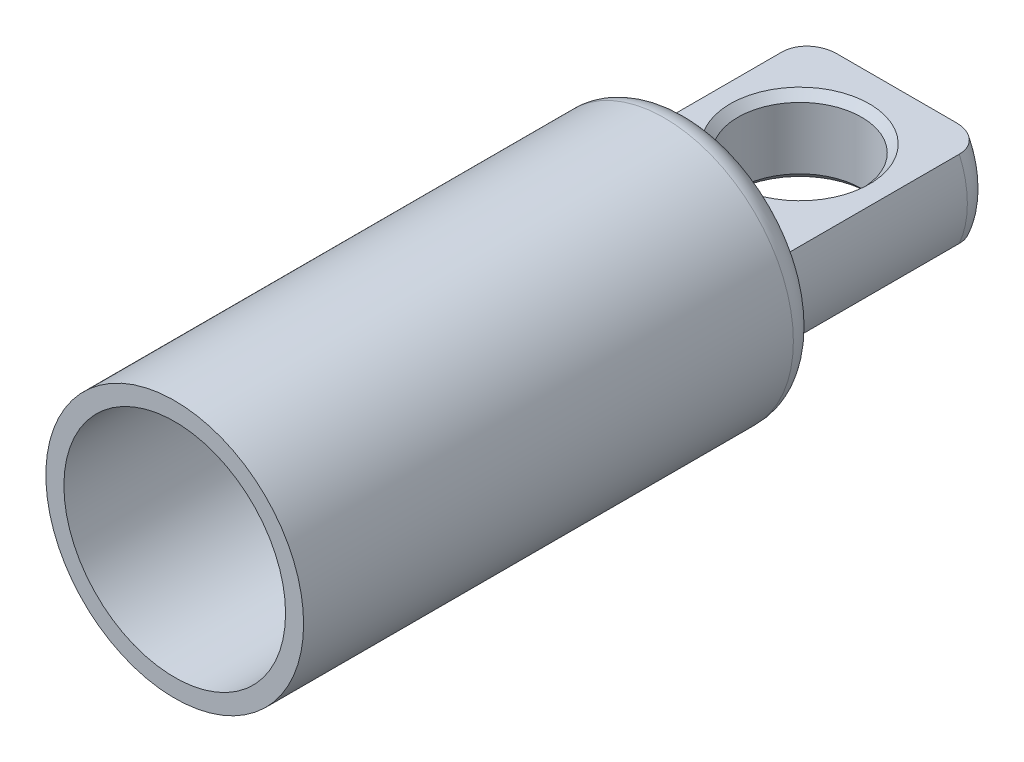
ISO-10303-21;
HEADER;
FILE_DESCRIPTION(('STEP AP214'),'2;1');
FILE_NAME('part.step','',(''),(''),'','','');
FILE_SCHEMA(('AUTOMOTIVE_DESIGN { 1 0 10303 214 1 1 1 1 }'));
ENDSEC;
DATA;
#1=APPLICATION_CONTEXT('core data for automotive mechanical design processes');
#2=APPLICATION_PROTOCOL_DEFINITION('international standard','automotive_design',2000,#1);
#3=PRODUCT_CONTEXT('',#1,'mechanical');
#4=PRODUCT('Part','Part','',(#3));
#5=PRODUCT_RELATED_PRODUCT_CATEGORY('part','',(#4));
#6=PRODUCT_DEFINITION_FORMATION('','',#4);
#7=PRODUCT_DEFINITION_CONTEXT('part definition',#1,'design');
#8=PRODUCT_DEFINITION('design','',#6,#7);
#9=PRODUCT_DEFINITION_SHAPE('','',#8);
#10=(LENGTH_UNIT() NAMED_UNIT(*) SI_UNIT(.MILLI.,.METRE.));
#11=(NAMED_UNIT(*) PLANE_ANGLE_UNIT() SI_UNIT($,.RADIAN.));
#12=(NAMED_UNIT(*) SI_UNIT($,.STERADIAN.) SOLID_ANGLE_UNIT());
#13=UNCERTAINTY_MEASURE_WITH_UNIT(LENGTH_MEASURE(1.E-05),#10,'distance_accuracy_value','');
#14=(GEOMETRIC_REPRESENTATION_CONTEXT(3) GLOBAL_UNCERTAINTY_ASSIGNED_CONTEXT((#13)) GLOBAL_UNIT_ASSIGNED_CONTEXT((#10,
#11,#12)) REPRESENTATION_CONTEXT('',''));
#15=CARTESIAN_POINT('',(0.,0.,0.));
#16=DIRECTION('',(0.,0.,1.));
#17=DIRECTION('',(1.,0.,0.));
#18=AXIS2_PLACEMENT_3D('',#15,#16,#17);
#19=CARTESIAN_POINT('',(0.,0.,-10.16));
#20=DIRECTION('',(0.,0.,1.));
#21=DIRECTION('',(1.,0.,0.));
#22=AXIS2_PLACEMENT_3D('',#19,#20,#21);
#23=CYLINDRICAL_SURFACE('',#22,4.7625);
#24=DIRECTION('',(0.,0.,-1.));
#25=VECTOR('',#24,1.);
#26=CARTESIAN_POINT('',(-4.36490334944544,1.905,0.));
#27=LINE('',#26,#25);
#28=CARTESIAN_POINT('',(-4.36490334944544,1.905,0.));
#29=VERTEX_POINT('',#28);
#30=CARTESIAN_POINT('',(-4.36490334944544,1.905,-8.89));
#31=VERTEX_POINT('',#30);
#32=EDGE_CURVE('E106',#29,#31,#27,.T.);
#33=ORIENTED_EDGE('',*,*,#32,.T.);
#34=CARTESIAN_POINT('',(0.,0.,-8.89));
#35=DIRECTION('',(0.,0.,-1.));
#36=DIRECTION('',(-1.,0.,0.));
#37=AXIS2_PLACEMENT_3D('',#34,#35,#36);
#38=CIRCLE('',#37,4.7625);
#39=CARTESIAN_POINT('',(-4.36490334944544,-1.905,-8.89));
#40=VERTEX_POINT('',#39);
#41=EDGE_CURVE('E69',#31,#40,#38,.F.);
#42=ORIENTED_EDGE('',*,*,#41,.T.);
#43=DIRECTION('',(0.,0.,-1.));
#44=VECTOR('',#43,1.);
#45=CARTESIAN_POINT('',(-4.36490334944544,-1.905,0.));
#46=LINE('',#45,#44);
#47=CARTESIAN_POINT('',(-4.36490334944544,-1.905,0.));
#48=VERTEX_POINT('',#47);
#49=EDGE_CURVE('E244',#48,#40,#46,.T.);
#50=ORIENTED_EDGE('',*,*,#49,.F.);
#51=CARTESIAN_POINT('',(0.,0.,0.));
#52=DIRECTION('',(0.,0.,1.));
#53=DIRECTION('',(1.,0.,0.));
#54=AXIS2_PLACEMENT_3D('',#51,#52,#53);
#55=CIRCLE('',#54,4.7625);
#56=EDGE_CURVE('E124',#48,#29,#55,.F.);
#57=ORIENTED_EDGE('',*,*,#56,.T.);
#58=EDGE_LOOP('',(#33,#42,#50,#57));
#59=FACE_BOUND('',#58,.T.);
#60=ADVANCED_FACE('F45',(#59),#23,.T.);
#61=DIRECTION('',(0.,0.,-1.));
#62=VECTOR('',#61,1.);
#63=CARTESIAN_POINT('',(4.36490334944544,-1.905,0.));
#64=LINE('',#63,#62);
#65=CARTESIAN_POINT('',(4.36490334944544,-1.905,0.));
#66=VERTEX_POINT('',#65);
#67=CARTESIAN_POINT('',(4.36490334944544,-1.905,-8.89));
#68=VERTEX_POINT('',#67);
#69=EDGE_CURVE('E242',#66,#68,#64,.T.);
#70=ORIENTED_EDGE('',*,*,#69,.T.);
#71=CARTESIAN_POINT('',(0.,0.,-8.89));
#72=DIRECTION('',(0.,0.,-1.));
#73=DIRECTION('',(-1.,0.,0.));
#74=AXIS2_PLACEMENT_3D('',#71,#72,#73);
#75=CIRCLE('',#74,4.7625);
#76=CARTESIAN_POINT('',(4.36490334944544,1.905,-8.89));
#77=VERTEX_POINT('',#76);
#78=EDGE_CURVE('E11',#68,#77,#75,.F.);
#79=ORIENTED_EDGE('',*,*,#78,.T.);
#80=DIRECTION('',(0.,0.,-1.));
#81=VECTOR('',#80,1.);
#82=CARTESIAN_POINT('',(4.36490334944544,1.905,0.));
#83=LINE('',#82,#81);
#84=CARTESIAN_POINT('',(4.36490334944544,1.905,0.));
#85=VERTEX_POINT('',#84);
#86=EDGE_CURVE('E104',#85,#77,#83,.T.);
#87=ORIENTED_EDGE('',*,*,#86,.F.);
#88=EDGE_CURVE('E116',#85,#66,#55,.F.);
#89=ORIENTED_EDGE('',*,*,#88,.T.);
#90=EDGE_LOOP('',(#70,#79,#87,#89));
#91=FACE_BOUND('',#90,.T.);
#92=ADVANCED_FACE('F115',(#91),#23,.T.);
#93=CARTESIAN_POINT('',(0.,0.,-10.16));
#94=DIRECTION('',(0.,0.,-1.));
#95=DIRECTION('',(-1.,0.,0.));
#96=AXIS2_PLACEMENT_3D('',#93,#94,#95);
#97=PLANE('',#96);
#98=DIRECTION('',(1.,0.,0.));
#99=VECTOR('',#98,1.);
#100=CARTESIAN_POINT('',(-4.36490334944544,-1.905,-10.16));
#101=LINE('',#100,#99);
#102=CARTESIAN_POINT('',(-2.92720536519049,-1.905,-10.16));
#103=VERTEX_POINT('',#102);
#104=CARTESIAN_POINT('',(2.92720536519049,-1.905,-10.16));
#105=VERTEX_POINT('',#104);
#106=EDGE_CURVE('E238',#103,#105,#101,.T.);
#107=ORIENTED_EDGE('',*,*,#106,.F.);
#108=CARTESIAN_POINT('',(0.,0.,-10.16));
#109=DIRECTION('',(0.,0.,-1.));
#110=DIRECTION('',(-1.,0.,0.));
#111=AXIS2_PLACEMENT_3D('',#108,#109,#110);
#112=CIRCLE('',#111,3.4925);
#113=CARTESIAN_POINT('',(-2.92720536519049,1.905,-10.16));
#114=VERTEX_POINT('',#113);
#115=EDGE_CURVE('E147',#103,#114,#112,.T.);
#116=ORIENTED_EDGE('',*,*,#115,.T.);
#117=DIRECTION('',(1.,0.,0.));
#118=VECTOR('',#117,1.);
#119=CARTESIAN_POINT('',(-4.36490334944544,1.905,-10.16));
#120=LINE('',#119,#118);
#121=CARTESIAN_POINT('',(2.92720536519049,1.905,-10.16));
#122=VERTEX_POINT('',#121);
#123=EDGE_CURVE('E111',#114,#122,#120,.T.);
#124=ORIENTED_EDGE('',*,*,#123,.T.);
#125=CARTESIAN_POINT('',(0.,0.,-10.16));
#126=DIRECTION('',(0.,0.,-1.));
#127=DIRECTION('',(-1.,0.,0.));
#128=AXIS2_PLACEMENT_3D('',#125,#126,#127);
#129=CIRCLE('',#128,3.4925);
#130=EDGE_CURVE('E144',#122,#105,#129,.T.);
#131=ORIENTED_EDGE('',*,*,#130,.T.);
#132=EDGE_LOOP('',(#107,#116,#124,#131));
#133=FACE_BOUND('',#132,.T.);
#134=ADVANCED_FACE('F176',(#133),#97,.T.);
#135=CARTESIAN_POINT('',(0.,0.,25.4));
#136=DIRECTION('',(0.,0.,-1.));
#137=DIRECTION('',(-1.,0.,0.));
#138=AXIS2_PLACEMENT_3D('',#135,#136,#137);
#139=CYLINDRICAL_SURFACE('',#138,6.35);
#140=CARTESIAN_POINT('',(0.,0.,1.27));
#141=DIRECTION('',(0.,0.,1.));
#142=DIRECTION('',(1.,0.,0.));
#143=AXIS2_PLACEMENT_3D('',#140,#141,#142);
#144=CIRCLE('',#143,6.35);
#145=CARTESIAN_POINT('',(6.35,0.,1.27));
#146=VERTEX_POINT('',#145);
#147=EDGE_CURVE('E129',#146,#146,#144,.T.);
#148=ORIENTED_EDGE('',*,*,#147,.T.);
#149=EDGE_LOOP('',(#148));
#150=FACE_BOUND('',#149,.T.);
#151=CARTESIAN_POINT('',(0.,0.,25.4));
#152=DIRECTION('',(0.,0.,1.));
#153=DIRECTION('',(1.,0.,0.));
#154=AXIS2_PLACEMENT_3D('',#151,#152,#153);
#155=CIRCLE('',#154,6.35);
#156=CARTESIAN_POINT('',(6.35,0.,25.4));
#157=VERTEX_POINT('',#156);
#158=EDGE_CURVE('E252',#157,#157,#155,.T.);
#159=ORIENTED_EDGE('',*,*,#158,.F.);
#160=EDGE_LOOP('',(#159));
#161=FACE_BOUND('',#160,.T.);
#162=ADVANCED_FACE('F212',(#150,#161),#139,.T.);
#163=CARTESIAN_POINT('',(0.,0.,25.4));
#164=DIRECTION('',(0.,0.,1.));
#165=DIRECTION('',(1.,0.,0.));
#166=AXIS2_PLACEMENT_3D('',#163,#164,#165);
#167=PLANE('',#166);
#168=CARTESIAN_POINT('',(0.,0.,25.4));
#169=DIRECTION('',(0.,0.,1.));
#170=DIRECTION('',(1.,0.,0.));
#171=AXIS2_PLACEMENT_3D('',#168,#169,#170);
#172=CIRCLE('',#171,5.461);
#173=CARTESIAN_POINT('',(5.461,0.,25.4));
#174=VERTEX_POINT('',#173);
#175=EDGE_CURVE('E249',#174,#174,#172,.T.);
#176=ORIENTED_EDGE('',*,*,#175,.F.);
#177=EDGE_LOOP('',(#176));
#178=FACE_BOUND('',#177,.T.);
#179=ORIENTED_EDGE('',*,*,#158,.T.);
#180=EDGE_LOOP('',(#179));
#181=FACE_BOUND('',#180,.T.);
#182=ADVANCED_FACE('F215',(#178,#181),#167,.T.);
#183=CARTESIAN_POINT('',(0.,0.,0.));
#184=DIRECTION('',(0.,0.,1.));
#185=DIRECTION('',(1.,0.,0.));
#186=AXIS2_PLACEMENT_3D('',#183,#184,#185);
#187=PLANE('',#186);
#188=ORIENTED_EDGE('',*,*,#56,.F.);
#189=DIRECTION('',(1.,0.,0.));
#190=VECTOR('',#189,1.);
#191=CARTESIAN_POINT('',(-4.36490334944544,-1.905,0.));
#192=LINE('',#191,#190);
#193=EDGE_CURVE('E123',#48,#66,#192,.T.);
#194=ORIENTED_EDGE('',*,*,#193,.T.);
#195=ORIENTED_EDGE('',*,*,#88,.F.);
#196=DIRECTION('',(1.,0.,0.));
#197=VECTOR('',#196,1.);
#198=CARTESIAN_POINT('',(-4.36490334944544,1.905,0.));
#199=LINE('',#198,#197);
#200=EDGE_CURVE('E100',#29,#85,#199,.T.);
#201=ORIENTED_EDGE('',*,*,#200,.F.);
#202=EDGE_LOOP('',(#188,#194,#195,#201));
#203=FACE_BOUND('',#202,.T.);
#204=CARTESIAN_POINT('',(0.,0.,0.));
#205=DIRECTION('',(0.,0.,1.));
#206=DIRECTION('',(1.,0.,0.));
#207=AXIS2_PLACEMENT_3D('',#204,#205,#206);
#208=CIRCLE('',#207,5.08);
#209=CARTESIAN_POINT('',(5.08,0.,0.));
#210=VERTEX_POINT('',#209);
#211=EDGE_CURVE('E125',#210,#210,#208,.F.);
#212=ORIENTED_EDGE('',*,*,#211,.T.);
#213=EDGE_LOOP('',(#212));
#214=FACE_BOUND('',#213,.T.);
#215=ADVANCED_FACE('F121',(#203,#214),#187,.F.);
#216=CARTESIAN_POINT('',(0.,0.,25.4));
#217=DIRECTION('',(0.,0.,-1.));
#218=DIRECTION('',(-1.,0.,0.));
#219=AXIS2_PLACEMENT_3D('',#216,#217,#218);
#220=CYLINDRICAL_SURFACE('',#219,5.461);
#221=ORIENTED_EDGE('',*,*,#175,.T.);
#222=EDGE_LOOP('',(#221));
#223=FACE_BOUND('',#222,.T.);
#224=CARTESIAN_POINT('',(0.,0.,0.889000000000001));
#225=DIRECTION('',(0.,0.,1.));
#226=DIRECTION('',(1.,0.,0.));
#227=AXIS2_PLACEMENT_3D('',#224,#225,#226);
#228=CIRCLE('',#227,5.461);
#229=CARTESIAN_POINT('',(5.461,0.,0.889000000000001));
#230=VERTEX_POINT('',#229);
#231=EDGE_CURVE('E118',#230,#230,#228,.T.);
#232=ORIENTED_EDGE('',*,*,#231,.F.);
#233=EDGE_LOOP('',(#232));
#234=FACE_BOUND('',#233,.T.);
#235=ADVANCED_FACE('F219',(#223,#234),#220,.F.);
#236=CARTESIAN_POINT('',(0.,0.,0.889));
#237=DIRECTION('',(0.,0.,1.));
#238=DIRECTION('',(1.,0.,0.));
#239=AXIS2_PLACEMENT_3D('',#236,#237,#238);
#240=PLANE('',#239);
#241=ORIENTED_EDGE('',*,*,#231,.T.);
#242=EDGE_LOOP('',(#241));
#243=FACE_BOUND('',#242,.T.);
#244=ADVANCED_FACE('F210',(#243),#240,.T.);
#245=CARTESIAN_POINT('',(0.,0.,1.27));
#246=DIRECTION('',(0.,0.,1.));
#247=DIRECTION('',(1.,0.,0.));
#248=AXIS2_PLACEMENT_3D('',#245,#246,#247);
#249=TOROIDAL_SURFACE('',#248,5.08,1.27);
#250=ORIENTED_EDGE('',*,*,#211,.F.);
#251=EDGE_LOOP('',(#250));
#252=FACE_BOUND('',#251,.T.);
#253=ORIENTED_EDGE('',*,*,#147,.F.);
#254=EDGE_LOOP('',(#253));
#255=FACE_BOUND('',#254,.T.);
#256=ADVANCED_FACE('F174',(#252,#255),#249,.T.);
#257=CARTESIAN_POINT('',(-4.36490334944544,-1.905,0.));
#258=DIRECTION('',(0.,1.,0.));
#259=DIRECTION('',(-1.,0.,0.));
#260=AXIS2_PLACEMENT_3D('',#257,#258,#259);
#261=PLANE('',#260);
#262=CARTESIAN_POINT('',(0.,-1.905,-5.3975));
#263=DIRECTION('',(0.,1.,0.));
#264=DIRECTION('',(-1.,0.,0.));
#265=AXIS2_PLACEMENT_3D('',#262,#263,#264);
#266=CIRCLE('',#265,3.42900000000001);
#267=CARTESIAN_POINT('',(-3.42900000000001,-1.905,-5.3975));
#268=VERTEX_POINT('',#267);
#269=EDGE_CURVE('E127',#268,#268,#266,.T.);
#270=ORIENTED_EDGE('',*,*,#269,.T.);
#271=EDGE_LOOP('',(#270));
#272=FACE_BOUND('',#271,.T.);
#273=ORIENTED_EDGE('',*,*,#49,.T.);
#274=CARTESIAN_POINT('',(-4.36490334944544,-1.905,-8.89));
#275=CARTESIAN_POINT('',(-4.36490422359483,-1.905,-8.92339919910838));
#276=CARTESIAN_POINT('',(-4.36346480508041,-1.905,-8.95678177763765));
#277=CARTESIAN_POINT('',(-4.35772999076058,-1.905,-9.02329490045136));
#278=CARTESIAN_POINT('',(-4.35343509534946,-1.905,-9.05642548786607));
#279=CARTESIAN_POINT('',(-4.33634337546593,-1.905,-9.15489806950019));
#280=CARTESIAN_POINT('',(-4.31933911241619,-1.905,-9.21955802636618));
#281=CARTESIAN_POINT('',(-4.27475667885088,-1.905,-9.34506168882081));
#282=CARTESIAN_POINT('',(-4.24717995463365,-1.905,-9.40590591507211));
#283=CARTESIAN_POINT('',(-4.1824556513036,-1.905,-9.52228788782987));
#284=CARTESIAN_POINT('',(-4.14530451663396,-1.905,-9.57782365245797));
#285=CARTESIAN_POINT('',(-4.06158354676759,-1.905,-9.6837275420454));
#286=CARTESIAN_POINT('',(-4.01478585752914,-1.905,-9.73391495783361));
#287=CARTESIAN_POINT('',(-3.91397899782167,-1.905,-9.8263799471498));
#288=CARTESIAN_POINT('',(-3.85996996730528,-1.905,-9.8686576741452));
#289=CARTESIAN_POINT('',(-3.74194657661533,-1.905,-9.94764916451322));
#290=CARTESIAN_POINT('',(-3.6774828837546,-1.905,-9.98368986955687));
#291=CARTESIAN_POINT('',(-3.54380992591659,-1.905,-10.0457069429606));
#292=CARTESIAN_POINT('',(-3.47459377568292,-1.905,-10.0716683304353));
#293=CARTESIAN_POINT('',(-3.32657767116101,-1.905,-10.1155078617819));
#294=CARTESIAN_POINT('',(-3.2474882057244,-1.905,-10.1323976470139));
#295=CARTESIAN_POINT('',(-3.08795205769954,-1.905,-10.1546476910731));
#296=CARTESIAN_POINT('',(-3.0075107274282,-1.905,-10.1600458876112));
#297=CARTESIAN_POINT('',(-2.92720536519049,-1.905,-10.16));
#298=B_SPLINE_CURVE_WITH_KNOTS('',3,(#274,#275,#276,#277,#278,#279,#280,#281,#282,#283,#284,
#285,#286,#287,#288,#289,#290,#291,#292,#293,#294,#295,#296,#297),.UNSPECIFIED.,.F.,.F.,(4,2,2,
2,2,2,2,2,2,2,2,4),(0.,0.100133888262804,0.20025023366848,0.399780863197951,0.599284206941912,
0.79886174535297,1.00384490895569,1.20882409496814,1.42948410837142,1.65047084446328,
1.89221565367468,2.13316113395296),.UNSPECIFIED.);
#299=EDGE_CURVE('E54',#40,#103,#298,.T.);
#300=ORIENTED_EDGE('',*,*,#299,.T.);
#301=ORIENTED_EDGE('',*,*,#106,.T.);
#302=CARTESIAN_POINT('',(2.92720536519049,-1.905,-10.16));
#303=CARTESIAN_POINT('',(2.98132402105542,-1.905,-10.1600064832095));
#304=CARTESIAN_POINT('',(3.03546640915895,-1.905,-10.1575694277126));
#305=CARTESIAN_POINT('',(3.14337038378051,-1.905,-10.147600787364));
#306=CARTESIAN_POINT('',(3.19713115345611,-1.905,-10.1400604319878));
#307=CARTESIAN_POINT('',(3.30381074626772,-1.905,-10.1196462465851));
#308=CARTESIAN_POINT('',(3.35672661587625,-1.905,-10.1067567396132));
#309=CARTESIAN_POINT('',(3.46087340765745,-1.905,-10.0755358837916));
#310=CARTESIAN_POINT('',(3.51210576523154,-1.905,-10.0572093118652));
#311=CARTESIAN_POINT('',(3.63377839124686,-1.905,-10.0059866506064));
#312=CARTESIAN_POINT('',(3.70303952694985,-1.905,-9.97021263677757));
#313=CARTESIAN_POINT('',(3.83451020752514,-1.905,-9.88771868456725));
#314=CARTESIAN_POINT('',(3.89673567753279,-1.905,-9.84102423131769));
#315=CARTESIAN_POINT('',(4.01235640306473,-1.905,-9.73713293052762));
#316=CARTESIAN_POINT('',(4.06570386564284,-1.905,-9.67988252894815));
#317=CARTESIAN_POINT('',(4.16092021285018,-1.905,-9.55641047586642));
#318=CARTESIAN_POINT('',(4.20278291350322,-1.905,-9.49018401976242));
#319=CARTESIAN_POINT('',(4.26985685386264,-1.905,-9.35715368823077));
#320=CARTESIAN_POINT('',(4.29622038509427,-1.905,-9.29092834996992));
#321=CARTESIAN_POINT('',(4.33658892991174,-1.905,-9.15489125363754));
#322=CARTESIAN_POINT('',(4.35062151379467,-1.905,-9.0850878676247));
#323=CARTESIAN_POINT('',(4.36043965484168,-1.905,-8.99397786798046));
#324=CARTESIAN_POINT('',(4.36211401183235,-1.905,-8.9732011982541));
#325=CARTESIAN_POINT('',(4.36434422473604,-1.905,-8.93161949765128));
#326=CARTESIAN_POINT('',(4.36490177407431,-1.905,-8.91081455765388));
#327=CARTESIAN_POINT('',(4.36490334944546,-1.905,-8.89));
#328=B_SPLINE_CURVE_WITH_KNOTS('',3,(#302,#303,#304,#305,#306,#307,#308,#309,#310,#311,#312,
#313,#314,#315,#316,#317,#318,#319,#320,#321,#322,#323,#324,#325,#326,#327),.UNSPECIFIED.,.F.,
.F.,(4,2,2,2,2,2,2,2,2,2,2,2,4),(0.,0.16233582682037,0.324951354612324,0.488046869242433,
0.650999512834123,0.883796058421267,1.11605465223083,1.34952572611191,1.58312226697818,
1.79588027556207,2.00816136727746,2.07067322340408,2.13309022028259),.UNSPECIFIED.);
#329=EDGE_CURVE('E61',#105,#68,#328,.T.);
#330=ORIENTED_EDGE('',*,*,#329,.T.);
#331=ORIENTED_EDGE('',*,*,#69,.F.);
#332=ORIENTED_EDGE('',*,*,#193,.F.);
#333=EDGE_LOOP('',(#273,#300,#301,#330,#331,#332));
#334=FACE_BOUND('',#333,.T.);
#335=ADVANCED_FACE('F168',(#272,#334),#261,.F.);
#336=CARTESIAN_POINT('',(-4.36490334944544,1.905,0.));
#337=DIRECTION('',(0.,1.,0.));
#338=DIRECTION('',(-1.,0.,0.));
#339=AXIS2_PLACEMENT_3D('',#336,#337,#338);
#340=PLANE('',#339);
#341=CARTESIAN_POINT('',(0.,1.905,-5.3975));
#342=DIRECTION('',(0.,1.,0.));
#343=DIRECTION('',(-1.,0.,0.));
#344=AXIS2_PLACEMENT_3D('',#341,#342,#343);
#345=CIRCLE('',#344,3.429);
#346=CARTESIAN_POINT('',(-3.429,1.905,-5.3975));
#347=VERTEX_POINT('',#346);
#348=EDGE_CURVE('E141',#347,#347,#345,.F.);
#349=ORIENTED_EDGE('',*,*,#348,.T.);
#350=EDGE_LOOP('',(#349));
#351=FACE_BOUND('',#350,.T.);
#352=ORIENTED_EDGE('',*,*,#123,.F.);
#353=CARTESIAN_POINT('',(-2.92720536519049,1.905,-10.16));
#354=CARTESIAN_POINT('',(-2.98132402105542,1.905,-10.1600064832095));
#355=CARTESIAN_POINT('',(-3.03546640915894,1.905,-10.1575694277126));
#356=CARTESIAN_POINT('',(-3.14337038378051,1.905,-10.147600787364));
#357=CARTESIAN_POINT('',(-3.19713115345611,1.905,-10.1400604319878));
#358=CARTESIAN_POINT('',(-3.30381074626772,1.905,-10.1196462465851));
#359=CARTESIAN_POINT('',(-3.35672661587625,1.905,-10.1067567396132));
#360=CARTESIAN_POINT('',(-3.46087340765745,1.905,-10.0755358837916));
#361=CARTESIAN_POINT('',(-3.51210576523154,1.905,-10.0572093118652));
#362=CARTESIAN_POINT('',(-3.63377839124686,1.905,-10.0059866506064));
#363=CARTESIAN_POINT('',(-3.70303952694985,1.905,-9.97021263677757));
#364=CARTESIAN_POINT('',(-3.83451020752514,1.905,-9.88771868456725));
#365=CARTESIAN_POINT('',(-3.89673567753279,1.905,-9.84102423131769));
#366=CARTESIAN_POINT('',(-4.01235640306473,1.905,-9.73713293052761));
#367=CARTESIAN_POINT('',(-4.06570386564284,1.905,-9.67988252894815));
#368=CARTESIAN_POINT('',(-4.16092021285018,1.905,-9.55641047586642));
#369=CARTESIAN_POINT('',(-4.20278291350322,1.905,-9.49018401976242));
#370=CARTESIAN_POINT('',(-4.26985685386264,1.905,-9.35715368823077));
#371=CARTESIAN_POINT('',(-4.29622038509427,1.905,-9.29092834996992));
#372=CARTESIAN_POINT('',(-4.33658892991174,1.905,-9.15489125363754));
#373=CARTESIAN_POINT('',(-4.35062151379467,1.905,-9.0850878676247));
#374=CARTESIAN_POINT('',(-4.36043965484168,1.905,-8.99397786798046));
#375=CARTESIAN_POINT('',(-4.36211401183235,1.905,-8.97320119825409));
#376=CARTESIAN_POINT('',(-4.36434422473604,1.905,-8.93161949765128));
#377=CARTESIAN_POINT('',(-4.36490177407431,1.905,-8.91081455765387));
#378=CARTESIAN_POINT('',(-4.36490334944546,1.905,-8.89));
#379=B_SPLINE_CURVE_WITH_KNOTS('',3,(#353,#354,#355,#356,#357,#358,#359,#360,#361,#362,#363,
#364,#365,#366,#367,#368,#369,#370,#371,#372,#373,#374,#375,#376,#377,#378),.UNSPECIFIED.,.F.,
.F.,(4,2,2,2,2,2,2,2,2,2,2,2,4),(0.,0.16233582682037,0.324951354612324,0.488046869242433,
0.650999512834123,0.883796058421268,1.11605465223083,1.34952572611191,1.58312226697818,
1.79588027556207,2.00816136727746,2.07067322340408,2.13309022028259),.UNSPECIFIED.);
#380=EDGE_CURVE('E157',#114,#31,#379,.T.);
#381=ORIENTED_EDGE('',*,*,#380,.T.);
#382=ORIENTED_EDGE('',*,*,#32,.F.);
#383=ORIENTED_EDGE('',*,*,#200,.T.);
#384=ORIENTED_EDGE('',*,*,#86,.T.);
#385=CARTESIAN_POINT('',(4.36490334944544,1.905,-8.89));
#386=CARTESIAN_POINT('',(4.36490422359483,1.905,-8.92339919910838));
#387=CARTESIAN_POINT('',(4.36346480508041,1.905,-8.95678177763765));
#388=CARTESIAN_POINT('',(4.35772999076058,1.905,-9.02329490045136));
#389=CARTESIAN_POINT('',(4.35343509534946,1.905,-9.05642548786607));
#390=CARTESIAN_POINT('',(4.33634337546593,1.905,-9.15489806950019));
#391=CARTESIAN_POINT('',(4.31933911241619,1.905,-9.21955802636618));
#392=CARTESIAN_POINT('',(4.27475667885088,1.905,-9.34506168882081));
#393=CARTESIAN_POINT('',(4.24717995463365,1.905,-9.40590591507211));
#394=CARTESIAN_POINT('',(4.1824556513036,1.905,-9.52228788782987));
#395=CARTESIAN_POINT('',(4.14530451663395,1.905,-9.57782365245797));
#396=CARTESIAN_POINT('',(4.06158354676759,1.905,-9.6837275420454));
#397=CARTESIAN_POINT('',(4.01478585752914,1.905,-9.73391495783361));
#398=CARTESIAN_POINT('',(3.91397899782167,1.905,-9.8263799471498));
#399=CARTESIAN_POINT('',(3.85996996730527,1.905,-9.8686576741452));
#400=CARTESIAN_POINT('',(3.74194657661533,1.905,-9.94764916451322));
#401=CARTESIAN_POINT('',(3.6774828837546,1.905,-9.98368986955687));
#402=CARTESIAN_POINT('',(3.54380992591659,1.905,-10.0457069429606));
#403=CARTESIAN_POINT('',(3.47459377568292,1.905,-10.0716683304353));
#404=CARTESIAN_POINT('',(3.32657767116101,1.905,-10.1155078617819));
#405=CARTESIAN_POINT('',(3.2474882057244,1.905,-10.1323976470139));
#406=CARTESIAN_POINT('',(3.08795205769954,1.905,-10.1546476910731));
#407=CARTESIAN_POINT('',(3.0075107274282,1.905,-10.1600458876112));
#408=CARTESIAN_POINT('',(2.92720536519049,1.905,-10.16));
#409=B_SPLINE_CURVE_WITH_KNOTS('',3,(#385,#386,#387,#388,#389,#390,#391,#392,#393,#394,#395,
#396,#397,#398,#399,#400,#401,#402,#403,#404,#405,#406,#407,#408),.UNSPECIFIED.,.F.,.F.,(4,2,2,
2,2,2,2,2,2,2,2,4),(0.,0.100133888262804,0.20025023366848,0.399780863197951,0.599284206941912,
0.79886174535297,1.00384490895569,1.20882409496814,1.42948410837142,1.65047084446328,
1.89221565367468,2.13316113395296),.UNSPECIFIED.);
#410=EDGE_CURVE('E150',#77,#122,#409,.T.);
#411=ORIENTED_EDGE('',*,*,#410,.T.);
#412=EDGE_LOOP('',(#352,#381,#382,#383,#384,#411));
#413=FACE_BOUND('',#412,.T.);
#414=ADVANCED_FACE('F103',(#351,#413),#340,.T.);
#415=CARTESIAN_POINT('',(0.,-6.35,-5.3975));
#416=DIRECTION('',(0.,1.,0.));
#417=DIRECTION('',(-1.,0.,0.));
#418=AXIS2_PLACEMENT_3D('',#415,#416,#417);
#419=CYLINDRICAL_SURFACE('',#418,3.048);
#420=CARTESIAN_POINT('',(0.,-1.52399999999999,-5.3975));
#421=DIRECTION('',(0.,1.,0.));
#422=DIRECTION('',(-1.,0.,0.));
#423=AXIS2_PLACEMENT_3D('',#420,#421,#422);
#424=CIRCLE('',#423,3.048);
#425=CARTESIAN_POINT('',(-3.048,-1.52399999999999,-5.3975));
#426=VERTEX_POINT('',#425);
#427=EDGE_CURVE('E138',#426,#426,#424,.F.);
#428=ORIENTED_EDGE('',*,*,#427,.T.);
#429=EDGE_LOOP('',(#428));
#430=FACE_BOUND('',#429,.T.);
#431=CARTESIAN_POINT('',(0.,1.524,-5.3975));
#432=DIRECTION('',(0.,1.,0.));
#433=DIRECTION('',(-1.,0.,0.));
#434=AXIS2_PLACEMENT_3D('',#431,#432,#433);
#435=CIRCLE('',#434,3.048);
#436=CARTESIAN_POINT('',(-3.048,1.524,-5.3975));
#437=VERTEX_POINT('',#436);
#438=EDGE_CURVE('E135',#437,#437,#435,.T.);
#439=ORIENTED_EDGE('',*,*,#438,.T.);
#440=EDGE_LOOP('',(#439));
#441=FACE_BOUND('',#440,.T.);
#442=ADVANCED_FACE('F167',(#430,#441),#419,.F.);
#443=CARTESIAN_POINT('',(0.,-1.905,-5.3975));
#444=DIRECTION('',(0.,-1.,0.));
#445=DIRECTION('',(1.,0.,0.));
#446=AXIS2_PLACEMENT_3D('',#443,#444,#445);
#447=CONICAL_SURFACE('',#446,3.42900000000001,0.785398163397449);
#448=ORIENTED_EDGE('',*,*,#427,.F.);
#449=EDGE_LOOP('',(#448));
#450=FACE_BOUND('',#449,.T.);
#451=ORIENTED_EDGE('',*,*,#269,.F.);
#452=EDGE_LOOP('',(#451));
#453=FACE_BOUND('',#452,.T.);
#454=ADVANCED_FACE('F201',(#450,#453),#447,.F.);
#455=CARTESIAN_POINT('',(0.,1.524,-5.3975));
#456=DIRECTION('',(0.,1.,0.));
#457=DIRECTION('',(-1.,0.,0.));
#458=AXIS2_PLACEMENT_3D('',#455,#456,#457);
#459=CONICAL_SURFACE('',#458,3.048,0.785398163397447);
#460=ORIENTED_EDGE('',*,*,#348,.F.);
#461=EDGE_LOOP('',(#460));
#462=FACE_BOUND('',#461,.T.);
#463=ORIENTED_EDGE('',*,*,#438,.F.);
#464=EDGE_LOOP('',(#463));
#465=FACE_BOUND('',#464,.T.);
#466=ADVANCED_FACE('F192',(#462,#465),#459,.F.);
#467=CARTESIAN_POINT('',(0.,0.,-8.89));
#468=DIRECTION('',(0.,0.,-1.));
#469=DIRECTION('',(-1.,0.,0.));
#470=AXIS2_PLACEMENT_3D('',#467,#468,#469);
#471=TOROIDAL_SURFACE('',#470,3.4925,1.27);
#472=ORIENTED_EDGE('',*,*,#299,.F.);
#473=ORIENTED_EDGE('',*,*,#41,.F.);
#474=ORIENTED_EDGE('',*,*,#380,.F.);
#475=ORIENTED_EDGE('',*,*,#115,.F.);
#476=EDGE_LOOP('',(#472,#473,#474,#475));
#477=FACE_BOUND('',#476,.T.);
#478=ADVANCED_FACE('F188',(#477),#471,.T.);
#479=CARTESIAN_POINT('',(0.,0.,-8.89));
#480=DIRECTION('',(0.,0.,-1.));
#481=DIRECTION('',(-1.,0.,0.));
#482=AXIS2_PLACEMENT_3D('',#479,#480,#481);
#483=TOROIDAL_SURFACE('',#482,3.4925,1.27);
#484=ORIENTED_EDGE('',*,*,#410,.F.);
#485=ORIENTED_EDGE('',*,*,#78,.F.);
#486=ORIENTED_EDGE('',*,*,#329,.F.);
#487=ORIENTED_EDGE('',*,*,#130,.F.);
#488=EDGE_LOOP('',(#484,#485,#486,#487));
#489=FACE_BOUND('',#488,.T.);
#490=ADVANCED_FACE('F47',(#489),#483,.T.);
#491=CLOSED_SHELL('',(#60,#92,#134,#162,#182,#215,#235,#244,#256,#335,#414,#442,#454,#466,#478,#490));
#492=MANIFOLD_SOLID_BREP('B2',#491);
#493=ADVANCED_BREP_SHAPE_REPRESENTATION('',(#18,#492),#14);
#494=SHAPE_DEFINITION_REPRESENTATION(#9,#493);
ENDSEC;
END-ISO-10303-21;
